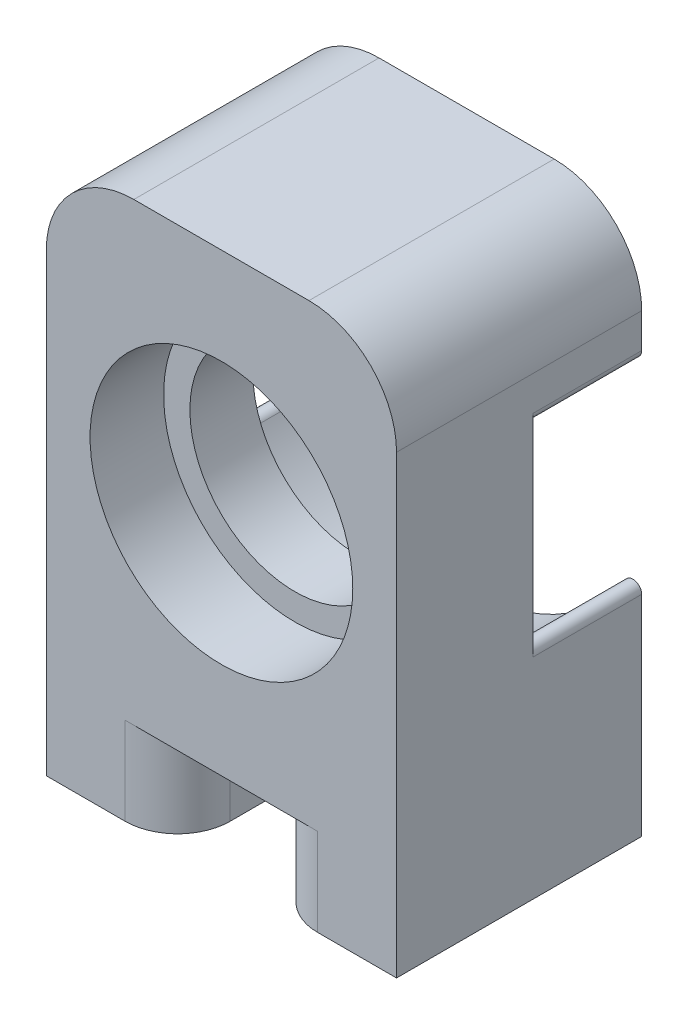
ISO-10303-21;
HEADER;
FILE_DESCRIPTION(('STEP AP214'),'2;1');
FILE_NAME('part.step','',(''),(''),'','','');
FILE_SCHEMA(('AUTOMOTIVE_DESIGN { 1 0 10303 214 1 1 1 1 }'));
ENDSEC;
DATA;
#1=APPLICATION_CONTEXT('core data for automotive mechanical design processes');
#2=APPLICATION_PROTOCOL_DEFINITION('international standard','automotive_design',2000,#1);
#3=PRODUCT_CONTEXT('',#1,'mechanical');
#4=PRODUCT('Part','Part','',(#3));
#5=PRODUCT_RELATED_PRODUCT_CATEGORY('part','',(#4));
#6=PRODUCT_DEFINITION_FORMATION('','',#4);
#7=PRODUCT_DEFINITION_CONTEXT('part definition',#1,'design');
#8=PRODUCT_DEFINITION('design','',#6,#7);
#9=PRODUCT_DEFINITION_SHAPE('','',#8);
#10=(LENGTH_UNIT() NAMED_UNIT(*) SI_UNIT(.MILLI.,.METRE.));
#11=(NAMED_UNIT(*) PLANE_ANGLE_UNIT() SI_UNIT($,.RADIAN.));
#12=(NAMED_UNIT(*) SI_UNIT($,.STERADIAN.) SOLID_ANGLE_UNIT());
#13=UNCERTAINTY_MEASURE_WITH_UNIT(LENGTH_MEASURE(1.E-05),#10,'distance_accuracy_value','');
#14=(GEOMETRIC_REPRESENTATION_CONTEXT(3) GLOBAL_UNCERTAINTY_ASSIGNED_CONTEXT((#13)) GLOBAL_UNIT_ASSIGNED_CONTEXT((#10,
#11,#12)) REPRESENTATION_CONTEXT('',''));
#15=CARTESIAN_POINT('',(0.,0.,0.));
#16=DIRECTION('',(0.,0.,1.));
#17=DIRECTION('',(1.,0.,0.));
#18=AXIS2_PLACEMENT_3D('',#15,#16,#17);
#19=CARTESIAN_POINT('',(-9.5,8.52598539659697,6.2));
#20=DIRECTION('',(0.,0.,-1.));
#21=DIRECTION('',(-1.,0.,0.));
#22=AXIS2_PLACEMENT_3D('',#19,#20,#21);
#23=CYLINDRICAL_SURFACE('',#22,0.5);
#24=CARTESIAN_POINT('',(-9.5,8.52598539659697,0.));
#25=DIRECTION('',(0.,0.,-1.));
#26=DIRECTION('',(-1.,0.,0.));
#27=AXIS2_PLACEMENT_3D('',#24,#25,#26);
#28=CIRCLE('',#27,0.5);
#29=CARTESIAN_POINT('',(-9.07777777777778,8.25816382341488,0.));
#30=VERTEX_POINT('',#29);
#31=CARTESIAN_POINT('',(-10.,8.52598539659697,0.));
#32=VERTEX_POINT('',#31);
#33=EDGE_CURVE('E270',#30,#32,#28,.T.);
#34=ORIENTED_EDGE('',*,*,#33,.F.);
#35=DIRECTION('',(0.,0.,-1.));
#36=VECTOR('',#35,1.);
#37=CARTESIAN_POINT('',(-9.07777777777778,8.25816382341488,6.2));
#38=LINE('',#37,#36);
#39=CARTESIAN_POINT('',(-9.07777777777778,8.25816382341488,6.2));
#40=VERTEX_POINT('',#39);
#41=EDGE_CURVE('E256',#40,#30,#38,.T.);
#42=ORIENTED_EDGE('',*,*,#41,.F.);
#43=CARTESIAN_POINT('',(-9.5,8.52598539659697,6.2));
#44=DIRECTION('',(0.,0.,1.));
#45=DIRECTION('',(-1.,0.,0.));
#46=AXIS2_PLACEMENT_3D('',#43,#44,#45);
#47=CIRCLE('',#46,0.5);
#48=CARTESIAN_POINT('',(-10.,8.52598539659697,6.2));
#49=VERTEX_POINT('',#48);
#50=EDGE_CURVE('E429',#49,#40,#47,.T.);
#51=ORIENTED_EDGE('',*,*,#50,.F.);
#52=DIRECTION('',(0.,0.,1.));
#53=VECTOR('',#52,1.);
#54=CARTESIAN_POINT('',(-10.,8.52598539659697,14.));
#55=LINE('',#54,#53);
#56=EDGE_CURVE('E345',#32,#49,#55,.T.);
#57=ORIENTED_EDGE('',*,*,#56,.F.);
#58=EDGE_LOOP('',(#34,#42,#51,#57));
#59=FACE_BOUND('',#58,.T.);
#60=ADVANCED_FACE('F17',(#59),#23,.T.);
#61=CARTESIAN_POINT('',(-9.5,-3.52598539659698,6.2));
#62=DIRECTION('',(0.,0.,-1.));
#63=DIRECTION('',(-1.,0.,0.));
#64=AXIS2_PLACEMENT_3D('',#61,#62,#63);
#65=CYLINDRICAL_SURFACE('',#64,0.5);
#66=CARTESIAN_POINT('',(-9.5,-3.52598539659698,6.2));
#67=DIRECTION('',(0.,0.,1.));
#68=DIRECTION('',(-1.,0.,0.));
#69=AXIS2_PLACEMENT_3D('',#66,#67,#68);
#70=CIRCLE('',#69,0.5);
#71=CARTESIAN_POINT('',(-9.07777777777778,-3.25816382341489,6.2));
#72=VERTEX_POINT('',#71);
#73=CARTESIAN_POINT('',(-10.,-3.52598539659698,6.2));
#74=VERTEX_POINT('',#73);
#75=EDGE_CURVE('E428',#72,#74,#70,.T.);
#76=ORIENTED_EDGE('',*,*,#75,.F.);
#77=DIRECTION('',(0.,0.,1.));
#78=VECTOR('',#77,1.);
#79=CARTESIAN_POINT('',(-9.07777777777778,-3.25816382341488,6.2));
#80=LINE('',#79,#78);
#81=CARTESIAN_POINT('',(-9.07777777777778,-3.25816382341489,0.));
#82=VERTEX_POINT('',#81);
#83=EDGE_CURVE('E336',#82,#72,#80,.T.);
#84=ORIENTED_EDGE('',*,*,#83,.F.);
#85=CARTESIAN_POINT('',(-9.5,-3.52598539659698,0.));
#86=DIRECTION('',(0.,0.,-1.));
#87=DIRECTION('',(-1.,0.,0.));
#88=AXIS2_PLACEMENT_3D('',#85,#86,#87);
#89=CIRCLE('',#88,0.5);
#90=CARTESIAN_POINT('',(-10.,-3.52598539659698,0.));
#91=VERTEX_POINT('',#90);
#92=EDGE_CURVE('E420',#91,#82,#89,.T.);
#93=ORIENTED_EDGE('',*,*,#92,.F.);
#94=DIRECTION('',(0.,0.,-1.));
#95=VECTOR('',#94,1.);
#96=CARTESIAN_POINT('',(-10.,-3.52598539659698,14.));
#97=LINE('',#96,#95);
#98=EDGE_CURVE('E349',#74,#91,#97,.T.);
#99=ORIENTED_EDGE('',*,*,#98,.F.);
#100=EDGE_LOOP('',(#76,#84,#93,#99));
#101=FACE_BOUND('',#100,.T.);
#102=ADVANCED_FACE('F559',(#101),#65,.T.);
#103=CARTESIAN_POINT('',(9.5,-3.52598539659698,6.2));
#104=DIRECTION('',(0.,0.,-1.));
#105=DIRECTION('',(-1.,0.,0.));
#106=AXIS2_PLACEMENT_3D('',#103,#104,#105);
#107=CYLINDRICAL_SURFACE('',#106,0.5);
#108=CARTESIAN_POINT('',(9.5,-3.52598539659698,0.));
#109=DIRECTION('',(0.,0.,-1.));
#110=DIRECTION('',(-1.,0.,0.));
#111=AXIS2_PLACEMENT_3D('',#108,#109,#110);
#112=CIRCLE('',#111,0.5);
#113=CARTESIAN_POINT('',(9.07777777777778,-3.2581638234149,0.));
#114=VERTEX_POINT('',#113);
#115=CARTESIAN_POINT('',(10.,-3.52598539659698,0.));
#116=VERTEX_POINT('',#115);
#117=EDGE_CURVE('E294',#114,#116,#112,.T.);
#118=ORIENTED_EDGE('',*,*,#117,.F.);
#119=DIRECTION('',(0.,0.,-1.));
#120=VECTOR('',#119,1.);
#121=CARTESIAN_POINT('',(9.07777777777778,-3.25816382341489,6.2));
#122=LINE('',#121,#120);
#123=CARTESIAN_POINT('',(9.07777777777778,-3.2581638234149,6.2));
#124=VERTEX_POINT('',#123);
#125=EDGE_CURVE('E334',#124,#114,#122,.T.);
#126=ORIENTED_EDGE('',*,*,#125,.F.);
#127=CARTESIAN_POINT('',(9.5,-3.52598539659698,6.2));
#128=DIRECTION('',(0.,0.,1.));
#129=DIRECTION('',(-1.,0.,0.));
#130=AXIS2_PLACEMENT_3D('',#127,#128,#129);
#131=CIRCLE('',#130,0.5);
#132=CARTESIAN_POINT('',(10.,-3.52598539659698,6.2));
#133=VERTEX_POINT('',#132);
#134=EDGE_CURVE('E419',#133,#124,#131,.T.);
#135=ORIENTED_EDGE('',*,*,#134,.F.);
#136=DIRECTION('',(0.,0.,1.));
#137=VECTOR('',#136,1.);
#138=CARTESIAN_POINT('',(10.,-3.52598539659698,14.));
#139=LINE('',#138,#137);
#140=EDGE_CURVE('E321',#116,#133,#139,.T.);
#141=ORIENTED_EDGE('',*,*,#140,.F.);
#142=EDGE_LOOP('',(#118,#126,#135,#141));
#143=FACE_BOUND('',#142,.T.);
#144=ADVANCED_FACE('F609',(#143),#107,.T.);
#145=CARTESIAN_POINT('',(9.5,8.52598539659697,6.2));
#146=DIRECTION('',(0.,0.,-1.));
#147=DIRECTION('',(-1.,0.,0.));
#148=AXIS2_PLACEMENT_3D('',#145,#146,#147);
#149=CYLINDRICAL_SURFACE('',#148,0.5);
#150=CARTESIAN_POINT('',(9.5,8.52598539659697,6.2));
#151=DIRECTION('',(0.,0.,1.));
#152=DIRECTION('',(-1.,0.,0.));
#153=AXIS2_PLACEMENT_3D('',#150,#151,#152);
#154=CIRCLE('',#153,0.5);
#155=CARTESIAN_POINT('',(9.07777777777778,8.25816382341488,6.2));
#156=VERTEX_POINT('',#155);
#157=CARTESIAN_POINT('',(10.,8.52598539659697,6.2));
#158=VERTEX_POINT('',#157);
#159=EDGE_CURVE('E251',#156,#158,#154,.T.);
#160=ORIENTED_EDGE('',*,*,#159,.F.);
#161=DIRECTION('',(0.,0.,1.));
#162=VECTOR('',#161,1.);
#163=CARTESIAN_POINT('',(9.07777777777778,8.25816382341488,6.2));
#164=LINE('',#163,#162);
#165=CARTESIAN_POINT('',(9.07777777777778,8.25816382341488,0.));
#166=VERTEX_POINT('',#165);
#167=EDGE_CURVE('E247',#166,#156,#164,.T.);
#168=ORIENTED_EDGE('',*,*,#167,.F.);
#169=CARTESIAN_POINT('',(9.5,8.52598539659697,0.));
#170=DIRECTION('',(0.,0.,-1.));
#171=DIRECTION('',(-1.,0.,0.));
#172=AXIS2_PLACEMENT_3D('',#169,#170,#171);
#173=CIRCLE('',#172,0.5);
#174=CARTESIAN_POINT('',(10.,8.52598539659697,0.));
#175=VERTEX_POINT('',#174);
#176=EDGE_CURVE('E253',#175,#166,#173,.T.);
#177=ORIENTED_EDGE('',*,*,#176,.F.);
#178=DIRECTION('',(0.,0.,-1.));
#179=VECTOR('',#178,1.);
#180=CARTESIAN_POINT('',(10.,8.52598539659697,14.));
#181=LINE('',#180,#179);
#182=EDGE_CURVE('E302',#158,#175,#181,.T.);
#183=ORIENTED_EDGE('',*,*,#182,.F.);
#184=EDGE_LOOP('',(#160,#168,#177,#183));
#185=FACE_BOUND('',#184,.T.);
#186=ADVANCED_FACE('F249',(#185),#149,.T.);
#187=CARTESIAN_POINT('',(-5.5,-15.5,4.));
#188=DIRECTION('',(0.,-1.,0.));
#189=DIRECTION('',(0.,0.,-1.));
#190=AXIS2_PLACEMENT_3D('',#187,#188,#189);
#191=CYLINDRICAL_SURFACE('',#190,1.25);
#192=CARTESIAN_POINT('',(-5.5,-8.,4.));
#193=DIRECTION('',(0.,-1.,0.));
#194=DIRECTION('',(0.,0.,-1.));
#195=AXIS2_PLACEMENT_3D('',#192,#193,#194);
#196=CIRCLE('',#195,1.25);
#197=CARTESIAN_POINT('',(-5.5,-8.,2.75));
#198=VERTEX_POINT('',#197);
#199=EDGE_CURVE('E11',#198,#198,#196,.T.);
#200=ORIENTED_EDGE('',*,*,#199,.F.);
#201=EDGE_LOOP('',(#200));
#202=FACE_BOUND('',#201,.T.);
#203=CARTESIAN_POINT('',(-5.5,-15.5,4.));
#204=DIRECTION('',(0.,-1.,0.));
#205=DIRECTION('',(0.,0.,-1.));
#206=AXIS2_PLACEMENT_3D('',#203,#204,#205);
#207=CIRCLE('',#206,1.25);
#208=CARTESIAN_POINT('',(-5.5,-15.5,2.75));
#209=VERTEX_POINT('',#208);
#210=EDGE_CURVE('E400',#209,#209,#207,.T.);
#211=ORIENTED_EDGE('',*,*,#210,.T.);
#212=EDGE_LOOP('',(#211));
#213=FACE_BOUND('',#212,.T.);
#214=ADVANCED_FACE('F620',(#202,#213),#191,.F.);
#215=CARTESIAN_POINT('',(-5.5,-8.,4.));
#216=DIRECTION('',(0.,-1.,0.));
#217=DIRECTION('',(0.,0.,-1.));
#218=AXIS2_PLACEMENT_3D('',#215,#216,#217);
#219=CONICAL_SURFACE('',#218,1.25,1.02974425867665);
#220=CARTESIAN_POINT('',(-5.5,-7.24892422621555,4.));
#221=VERTEX_POINT('',#220);
#222=VERTEX_LOOP('',#221);
#223=FACE_BOUND('',#222,.T.);
#224=ORIENTED_EDGE('',*,*,#199,.T.);
#225=EDGE_LOOP('',(#224));
#226=FACE_BOUND('',#225,.T.);
#227=ADVANCED_FACE('F618',(#223,#226),#219,.F.);
#228=CARTESIAN_POINT('',(5.5,-15.5,4.));
#229=DIRECTION('',(0.,-1.,0.));
#230=DIRECTION('',(0.,0.,-1.));
#231=AXIS2_PLACEMENT_3D('',#228,#229,#230);
#232=CYLINDRICAL_SURFACE('',#231,1.25);
#233=CARTESIAN_POINT('',(5.5,-8.,4.));
#234=DIRECTION('',(0.,-1.,0.));
#235=DIRECTION('',(0.,0.,-1.));
#236=AXIS2_PLACEMENT_3D('',#233,#234,#235);
#237=CIRCLE('',#236,1.25);
#238=CARTESIAN_POINT('',(5.5,-8.,2.75));
#239=VERTEX_POINT('',#238);
#240=EDGE_CURVE('E20',#239,#239,#237,.T.);
#241=ORIENTED_EDGE('',*,*,#240,.F.);
#242=EDGE_LOOP('',(#241));
#243=FACE_BOUND('',#242,.T.);
#244=CARTESIAN_POINT('',(5.5,-15.5,4.));
#245=DIRECTION('',(0.,-1.,0.));
#246=DIRECTION('',(0.,0.,-1.));
#247=AXIS2_PLACEMENT_3D('',#244,#245,#246);
#248=CIRCLE('',#247,1.25);
#249=CARTESIAN_POINT('',(5.5,-15.5,2.75));
#250=VERTEX_POINT('',#249);
#251=EDGE_CURVE('E501',#250,#250,#248,.T.);
#252=ORIENTED_EDGE('',*,*,#251,.T.);
#253=EDGE_LOOP('',(#252));
#254=FACE_BOUND('',#253,.T.);
#255=ADVANCED_FACE('F622',(#243,#254),#232,.F.);
#256=CARTESIAN_POINT('',(5.5,-8.,4.));
#257=DIRECTION('',(0.,-1.,0.));
#258=DIRECTION('',(0.,0.,-1.));
#259=AXIS2_PLACEMENT_3D('',#256,#257,#258);
#260=CONICAL_SURFACE('',#259,1.25,1.02974425867665);
#261=CARTESIAN_POINT('',(5.5,-7.24892422621555,4.));
#262=VERTEX_POINT('',#261);
#263=VERTEX_LOOP('',#262);
#264=FACE_BOUND('',#263,.T.);
#265=ORIENTED_EDGE('',*,*,#240,.T.);
#266=EDGE_LOOP('',(#265));
#267=FACE_BOUND('',#266,.T.);
#268=ADVANCED_FACE('F630',(#264,#267),#260,.F.);
#269=CARTESIAN_POINT('',(5.5,0.,11.));
#270=DIRECTION('',(0.,-1.,0.));
#271=DIRECTION('',(0.,0.,-1.));
#272=AXIS2_PLACEMENT_3D('',#269,#270,#271);
#273=CYLINDRICAL_SURFACE('',#272,3.);
#274=CARTESIAN_POINT('',(5.5,-10.5,11.));
#275=DIRECTION('',(0.,1.,0.));
#276=DIRECTION('',(0.,0.,1.));
#277=AXIS2_PLACEMENT_3D('',#274,#275,#276);
#278=CIRCLE('',#277,3.);
#279=CARTESIAN_POINT('',(2.5,-10.5,11.));
#280=VERTEX_POINT('',#279);
#281=CARTESIAN_POINT('',(5.5,-10.5,14.));
#282=VERTEX_POINT('',#281);
#283=EDGE_CURVE('E463',#280,#282,#278,.T.);
#284=ORIENTED_EDGE('',*,*,#283,.F.);
#285=DIRECTION('',(0.,1.,0.));
#286=VECTOR('',#285,1.);
#287=CARTESIAN_POINT('',(2.5,-10.5,11.));
#288=LINE('',#287,#286);
#289=CARTESIAN_POINT('',(2.5,-15.5,11.));
#290=VERTEX_POINT('',#289);
#291=EDGE_CURVE('E450',#290,#280,#288,.T.);
#292=ORIENTED_EDGE('',*,*,#291,.F.);
#293=CARTESIAN_POINT('',(5.5,-15.5,11.));
#294=DIRECTION('',(0.,-1.,0.));
#295=DIRECTION('',(0.,0.,1.));
#296=AXIS2_PLACEMENT_3D('',#293,#294,#295);
#297=CIRCLE('',#296,3.);
#298=CARTESIAN_POINT('',(5.5,-15.5,14.));
#299=VERTEX_POINT('',#298);
#300=EDGE_CURVE('E492',#299,#290,#297,.T.);
#301=ORIENTED_EDGE('',*,*,#300,.F.);
#302=DIRECTION('',(0.,-1.,0.));
#303=VECTOR('',#302,1.);
#304=CARTESIAN_POINT('',(5.5,0.,14.));
#305=LINE('',#304,#303);
#306=EDGE_CURVE('E407',#282,#299,#305,.T.);
#307=ORIENTED_EDGE('',*,*,#306,.F.);
#308=EDGE_LOOP('',(#284,#292,#301,#307));
#309=FACE_BOUND('',#308,.T.);
#310=ADVANCED_FACE('F495',(#309),#273,.T.);
#311=CARTESIAN_POINT('',(-5.5,0.,11.));
#312=DIRECTION('',(0.,1.,0.));
#313=DIRECTION('',(0.,0.,1.));
#314=AXIS2_PLACEMENT_3D('',#311,#312,#313);
#315=CYLINDRICAL_SURFACE('',#314,3.);
#316=CARTESIAN_POINT('',(-5.5,-15.5,11.));
#317=DIRECTION('',(0.,-1.,0.));
#318=DIRECTION('',(0.,0.,1.));
#319=AXIS2_PLACEMENT_3D('',#316,#317,#318);
#320=CIRCLE('',#319,3.);
#321=CARTESIAN_POINT('',(-2.5,-15.5,11.));
#322=VERTEX_POINT('',#321);
#323=CARTESIAN_POINT('',(-5.5,-15.5,14.));
#324=VERTEX_POINT('',#323);
#325=EDGE_CURVE('E384',#322,#324,#320,.T.);
#326=ORIENTED_EDGE('',*,*,#325,.F.);
#327=DIRECTION('',(0.,-1.,0.));
#328=VECTOR('',#327,1.);
#329=CARTESIAN_POINT('',(-2.5,-10.5,11.));
#330=LINE('',#329,#328);
#331=CARTESIAN_POINT('',(-2.5,-10.5,11.));
#332=VERTEX_POINT('',#331);
#333=EDGE_CURVE('E465',#332,#322,#330,.T.);
#334=ORIENTED_EDGE('',*,*,#333,.F.);
#335=CARTESIAN_POINT('',(-5.5,-10.5,11.));
#336=DIRECTION('',(0.,1.,0.));
#337=DIRECTION('',(0.,0.,1.));
#338=AXIS2_PLACEMENT_3D('',#335,#336,#337);
#339=CIRCLE('',#338,3.);
#340=CARTESIAN_POINT('',(-5.5,-10.5,14.));
#341=VERTEX_POINT('',#340);
#342=EDGE_CURVE('E311',#341,#332,#339,.T.);
#343=ORIENTED_EDGE('',*,*,#342,.F.);
#344=DIRECTION('',(0.,1.,0.));
#345=VECTOR('',#344,1.);
#346=CARTESIAN_POINT('',(-5.5,0.,14.));
#347=LINE('',#346,#345);
#348=EDGE_CURVE('E398',#324,#341,#347,.T.);
#349=ORIENTED_EDGE('',*,*,#348,.F.);
#350=EDGE_LOOP('',(#326,#334,#343,#349));
#351=FACE_BOUND('',#350,.T.);
#352=ADVANCED_FACE('F634',(#351),#315,.T.);
#353=CARTESIAN_POINT('',(5.5,-10.5,3.));
#354=DIRECTION('',(0.,1.,0.));
#355=DIRECTION('',(0.,0.,1.));
#356=AXIS2_PLACEMENT_3D('',#353,#354,#355);
#357=CYLINDRICAL_SURFACE('',#356,3.);
#358=CARTESIAN_POINT('',(5.5,-10.5,3.));
#359=DIRECTION('',(0.,1.,0.));
#360=DIRECTION('',(0.,0.,1.));
#361=AXIS2_PLACEMENT_3D('',#358,#359,#360);
#362=CIRCLE('',#361,3.);
#363=CARTESIAN_POINT('',(5.5,-10.5,0.));
#364=VERTEX_POINT('',#363);
#365=CARTESIAN_POINT('',(2.5,-10.5,3.));
#366=VERTEX_POINT('',#365);
#367=EDGE_CURVE('E282',#364,#366,#362,.T.);
#368=ORIENTED_EDGE('',*,*,#367,.F.);
#369=DIRECTION('',(0.,1.,0.));
#370=VECTOR('',#369,1.);
#371=CARTESIAN_POINT('',(5.5,-10.5,0.));
#372=LINE('',#371,#370);
#373=CARTESIAN_POINT('',(5.5,-15.5,0.));
#374=VERTEX_POINT('',#373);
#375=EDGE_CURVE('E356',#374,#364,#372,.T.);
#376=ORIENTED_EDGE('',*,*,#375,.F.);
#377=CARTESIAN_POINT('',(5.5,-15.5,3.));
#378=DIRECTION('',(0.,-1.,0.));
#379=DIRECTION('',(0.,0.,1.));
#380=AXIS2_PLACEMENT_3D('',#377,#378,#379);
#381=CIRCLE('',#380,3.);
#382=CARTESIAN_POINT('',(2.5,-15.5,3.));
#383=VERTEX_POINT('',#382);
#384=EDGE_CURVE('E483',#383,#374,#381,.T.);
#385=ORIENTED_EDGE('',*,*,#384,.F.);
#386=DIRECTION('',(0.,-1.,0.));
#387=VECTOR('',#386,1.);
#388=CARTESIAN_POINT('',(2.5,-15.5,3.));
#389=LINE('',#388,#387);
#390=EDGE_CURVE('E447',#366,#383,#389,.T.);
#391=ORIENTED_EDGE('',*,*,#390,.F.);
#392=EDGE_LOOP('',(#368,#376,#385,#391));
#393=FACE_BOUND('',#392,.T.);
#394=ADVANCED_FACE('F481',(#393),#357,.T.);
#395=CARTESIAN_POINT('',(-5.5,-10.5,3.));
#396=DIRECTION('',(0.,-1.,0.));
#397=DIRECTION('',(0.,0.,-1.));
#398=AXIS2_PLACEMENT_3D('',#395,#396,#397);
#399=CYLINDRICAL_SURFACE('',#398,3.);
#400=CARTESIAN_POINT('',(-5.5,-15.5,3.));
#401=DIRECTION('',(0.,-1.,0.));
#402=DIRECTION('',(0.,0.,1.));
#403=AXIS2_PLACEMENT_3D('',#400,#401,#402);
#404=CIRCLE('',#403,3.);
#405=CARTESIAN_POINT('',(-5.5,-15.5,0.));
#406=VERTEX_POINT('',#405);
#407=CARTESIAN_POINT('',(-2.5,-15.5,3.));
#408=VERTEX_POINT('',#407);
#409=EDGE_CURVE('E342',#406,#408,#404,.T.);
#410=ORIENTED_EDGE('',*,*,#409,.F.);
#411=DIRECTION('',(0.,-1.,0.));
#412=VECTOR('',#411,1.);
#413=CARTESIAN_POINT('',(-5.5,-15.5,0.));
#414=LINE('',#413,#412);
#415=CARTESIAN_POINT('',(-5.5,-10.5,0.));
#416=VERTEX_POINT('',#415);
#417=EDGE_CURVE('E418',#416,#406,#414,.T.);
#418=ORIENTED_EDGE('',*,*,#417,.F.);
#419=CARTESIAN_POINT('',(-5.5,-10.5,3.));
#420=DIRECTION('',(0.,1.,0.));
#421=DIRECTION('',(0.,0.,1.));
#422=AXIS2_PLACEMENT_3D('',#419,#420,#421);
#423=CIRCLE('',#422,3.);
#424=CARTESIAN_POINT('',(-2.5,-10.5,3.));
#425=VERTEX_POINT('',#424);
#426=EDGE_CURVE('E309',#425,#416,#423,.T.);
#427=ORIENTED_EDGE('',*,*,#426,.F.);
#428=DIRECTION('',(0.,1.,0.));
#429=VECTOR('',#428,1.);
#430=CARTESIAN_POINT('',(-2.5,-10.5,3.));
#431=LINE('',#430,#429);
#432=EDGE_CURVE('E451',#408,#425,#431,.T.);
#433=ORIENTED_EDGE('',*,*,#432,.F.);
#434=EDGE_LOOP('',(#410,#418,#427,#433));
#435=FACE_BOUND('',#434,.T.);
#436=ADVANCED_FACE('F640',(#435),#399,.T.);
#437=CARTESIAN_POINT('',(0.,-10.5,0.));
#438=DIRECTION('',(0.,1.,0.));
#439=DIRECTION('',(1.,0.,0.));
#440=AXIS2_PLACEMENT_3D('',#437,#438,#439);
#441=PLANE('',#440);
#442=DIRECTION('',(1.,0.,0.));
#443=VECTOR('',#442,1.);
#444=CARTESIAN_POINT('',(0.,-10.5,14.));
#445=LINE('',#444,#443);
#446=EDGE_CURVE('E402',#341,#282,#445,.T.);
#447=ORIENTED_EDGE('',*,*,#446,.F.);
#448=ORIENTED_EDGE('',*,*,#342,.T.);
#449=DIRECTION('',(0.,0.,-1.));
#450=VECTOR('',#449,1.);
#451=CARTESIAN_POINT('',(-2.5,-10.5,-2.61373756311646));
#452=LINE('',#451,#450);
#453=EDGE_CURVE('E458',#332,#425,#452,.T.);
#454=ORIENTED_EDGE('',*,*,#453,.T.);
#455=ORIENTED_EDGE('',*,*,#426,.T.);
#456=DIRECTION('',(1.,0.,0.));
#457=VECTOR('',#456,1.);
#458=CARTESIAN_POINT('',(0.,-10.5,0.));
#459=LINE('',#458,#457);
#460=EDGE_CURVE('E361',#416,#364,#459,.T.);
#461=ORIENTED_EDGE('',*,*,#460,.T.);
#462=ORIENTED_EDGE('',*,*,#367,.T.);
#463=DIRECTION('',(0.,0.,1.));
#464=VECTOR('',#463,1.);
#465=CARTESIAN_POINT('',(2.5,-10.5,-2.61373756311646));
#466=LINE('',#465,#464);
#467=EDGE_CURVE('E386',#366,#280,#466,.T.);
#468=ORIENTED_EDGE('',*,*,#467,.T.);
#469=ORIENTED_EDGE('',*,*,#283,.T.);
#470=EDGE_LOOP('',(#447,#448,#454,#455,#461,#462,#468,#469));
#471=FACE_BOUND('',#470,.T.);
#472=ADVANCED_FACE('F478',(#471),#441,.F.);
#473=CARTESIAN_POINT('',(-2.5,-10.5,-2.61373756311646));
#474=DIRECTION('',(-1.,0.,0.));
#475=DIRECTION('',(0.,0.,1.));
#476=AXIS2_PLACEMENT_3D('',#473,#474,#475);
#477=PLANE('',#476);
#478=DIRECTION('',(0.,0.,-1.));
#479=VECTOR('',#478,1.);
#480=CARTESIAN_POINT('',(-2.5,-15.5,-2.61373756311646));
#481=LINE('',#480,#479);
#482=EDGE_CURVE('E381',#322,#408,#481,.T.);
#483=ORIENTED_EDGE('',*,*,#482,.T.);
#484=ORIENTED_EDGE('',*,*,#432,.T.);
#485=ORIENTED_EDGE('',*,*,#453,.F.);
#486=ORIENTED_EDGE('',*,*,#333,.T.);
#487=EDGE_LOOP('',(#483,#484,#485,#486));
#488=FACE_BOUND('',#487,.T.);
#489=ADVANCED_FACE('F642',(#488),#477,.F.);
#490=CARTESIAN_POINT('',(2.5,-10.5,-2.61373756311646));
#491=DIRECTION('',(1.,0.,0.));
#492=DIRECTION('',(0.,1.,0.));
#493=AXIS2_PLACEMENT_3D('',#490,#491,#492);
#494=PLANE('',#493);
#495=ORIENTED_EDGE('',*,*,#467,.F.);
#496=ORIENTED_EDGE('',*,*,#390,.T.);
#497=DIRECTION('',(0.,0.,1.));
#498=VECTOR('',#497,1.);
#499=CARTESIAN_POINT('',(2.5,-15.5,-2.61373756311646));
#500=LINE('',#499,#498);
#501=EDGE_CURVE('E488',#383,#290,#500,.T.);
#502=ORIENTED_EDGE('',*,*,#501,.T.);
#503=ORIENTED_EDGE('',*,*,#291,.T.);
#504=EDGE_LOOP('',(#495,#496,#502,#503));
#505=FACE_BOUND('',#504,.T.);
#506=ADVANCED_FACE('F490',(#505),#494,.F.);
#507=CARTESIAN_POINT('',(-5.,10.5,14.));
#508=DIRECTION('',(0.,0.,-1.));
#509=DIRECTION('',(-1.,0.,0.));
#510=AXIS2_PLACEMENT_3D('',#507,#508,#509);
#511=CYLINDRICAL_SURFACE('',#510,5.);
#512=CARTESIAN_POINT('',(-5.,10.5,14.));
#513=DIRECTION('',(0.,0.,1.));
#514=DIRECTION('',(-1.,0.,0.));
#515=AXIS2_PLACEMENT_3D('',#512,#513,#514);
#516=CIRCLE('',#515,5.);
#517=CARTESIAN_POINT('',(-5.,15.5,14.));
#518=VERTEX_POINT('',#517);
#519=CARTESIAN_POINT('',(-10.,10.5,14.));
#520=VERTEX_POINT('',#519);
#521=EDGE_CURVE('E380',#518,#520,#516,.T.);
#522=ORIENTED_EDGE('',*,*,#521,.F.);
#523=DIRECTION('',(0.,0.,1.));
#524=VECTOR('',#523,1.);
#525=CARTESIAN_POINT('',(-5.,15.5,14.));
#526=LINE('',#525,#524);
#527=CARTESIAN_POINT('',(-5.,15.5,0.));
#528=VERTEX_POINT('',#527);
#529=EDGE_CURVE('E335',#528,#518,#526,.T.);
#530=ORIENTED_EDGE('',*,*,#529,.F.);
#531=CARTESIAN_POINT('',(-5.,10.5,0.));
#532=DIRECTION('',(0.,0.,-1.));
#533=DIRECTION('',(-1.,0.,0.));
#534=AXIS2_PLACEMENT_3D('',#531,#532,#533);
#535=CIRCLE('',#534,5.);
#536=CARTESIAN_POINT('',(-10.,10.5,0.));
#537=VERTEX_POINT('',#536);
#538=EDGE_CURVE('E285',#537,#528,#535,.T.);
#539=ORIENTED_EDGE('',*,*,#538,.F.);
#540=DIRECTION('',(0.,0.,-1.));
#541=VECTOR('',#540,1.);
#542=CARTESIAN_POINT('',(-10.,10.5,14.));
#543=LINE('',#542,#541);
#544=EDGE_CURVE('E371',#520,#537,#543,.T.);
#545=ORIENTED_EDGE('',*,*,#544,.F.);
#546=EDGE_LOOP('',(#522,#530,#539,#545));
#547=FACE_BOUND('',#546,.T.);
#548=ADVANCED_FACE('F569',(#547),#511,.T.);
#549=CARTESIAN_POINT('',(5.,10.5,14.));
#550=DIRECTION('',(0.,0.,-1.));
#551=DIRECTION('',(-1.,0.,0.));
#552=AXIS2_PLACEMENT_3D('',#549,#550,#551);
#553=CYLINDRICAL_SURFACE('',#552,5.);
#554=CARTESIAN_POINT('',(5.,10.5,14.));
#555=DIRECTION('',(0.,0.,1.));
#556=DIRECTION('',(-1.,0.,0.));
#557=AXIS2_PLACEMENT_3D('',#554,#555,#556);
#558=CIRCLE('',#557,5.);
#559=CARTESIAN_POINT('',(10.,10.5,14.));
#560=VERTEX_POINT('',#559);
#561=CARTESIAN_POINT('',(5.,15.5,14.));
#562=VERTEX_POINT('',#561);
#563=EDGE_CURVE('E379',#560,#562,#558,.T.);
#564=ORIENTED_EDGE('',*,*,#563,.F.);
#565=DIRECTION('',(0.,0.,1.));
#566=VECTOR('',#565,1.);
#567=CARTESIAN_POINT('',(10.,10.5,14.));
#568=LINE('',#567,#566);
#569=CARTESIAN_POINT('',(10.,10.5,0.));
#570=VERTEX_POINT('',#569);
#571=EDGE_CURVE('E303',#570,#560,#568,.T.);
#572=ORIENTED_EDGE('',*,*,#571,.F.);
#573=CARTESIAN_POINT('',(5.,10.5,0.));
#574=DIRECTION('',(0.,0.,-1.));
#575=DIRECTION('',(-1.,0.,0.));
#576=AXIS2_PLACEMENT_3D('',#573,#574,#575);
#577=CIRCLE('',#576,5.);
#578=CARTESIAN_POINT('',(5.,15.5,0.));
#579=VERTEX_POINT('',#578);
#580=EDGE_CURVE('E305',#579,#570,#577,.T.);
#581=ORIENTED_EDGE('',*,*,#580,.F.);
#582=DIRECTION('',(0.,0.,-1.));
#583=VECTOR('',#582,1.);
#584=CARTESIAN_POINT('',(5.,15.5,14.));
#585=LINE('',#584,#583);
#586=EDGE_CURVE('E328',#562,#579,#585,.T.);
#587=ORIENTED_EDGE('',*,*,#586,.F.);
#588=EDGE_LOOP('',(#564,#572,#581,#587));
#589=FACE_BOUND('',#588,.T.);
#590=ADVANCED_FACE('F580',(#589),#553,.T.);
#591=CARTESIAN_POINT('',(0.,2.5,9.8));
#592=DIRECTION('',(0.,0.,1.));
#593=DIRECTION('',(1.,0.,0.));
#594=AXIS2_PLACEMENT_3D('',#591,#592,#593);
#595=CYLINDRICAL_SURFACE('',#594,7.5);
#596=CARTESIAN_POINT('',(0.,2.5,9.8));
#597=DIRECTION('',(0.,0.,1.));
#598=DIRECTION('',(1.,0.,0.));
#599=AXIS2_PLACEMENT_3D('',#596,#597,#598);
#600=CIRCLE('',#599,7.5);
#601=CARTESIAN_POINT('',(7.5,2.5,9.8));
#602=VERTEX_POINT('',#601);
#603=EDGE_CURVE('E387',#602,#602,#600,.T.);
#604=ORIENTED_EDGE('',*,*,#603,.F.);
#605=EDGE_LOOP('',(#604));
#606=FACE_BOUND('',#605,.T.);
#607=CARTESIAN_POINT('',(0.,2.5,14.));
#608=DIRECTION('',(0.,0.,1.));
#609=DIRECTION('',(1.,0.,0.));
#610=AXIS2_PLACEMENT_3D('',#607,#608,#609);
#611=CIRCLE('',#610,7.5);
#612=CARTESIAN_POINT('',(7.5,2.5,14.));
#613=VERTEX_POINT('',#612);
#614=EDGE_CURVE('E296',#613,#613,#611,.T.);
#615=ORIENTED_EDGE('',*,*,#614,.T.);
#616=EDGE_LOOP('',(#615));
#617=FACE_BOUND('',#616,.T.);
#618=ADVANCED_FACE('F651',(#606,#617),#595,.F.);
#619=CARTESIAN_POINT('',(0.,2.5,9.8));
#620=DIRECTION('',(0.,0.,1.));
#621=DIRECTION('',(1.,0.,0.));
#622=AXIS2_PLACEMENT_3D('',#619,#620,#621);
#623=PLANE('',#622);
#624=CARTESIAN_POINT('',(0.,2.5,9.8));
#625=DIRECTION('',(0.,0.,-1.));
#626=DIRECTION('',(1.,0.,0.));
#627=AXIS2_PLACEMENT_3D('',#624,#625,#626);
#628=CIRCLE('',#627,6.);
#629=CARTESIAN_POINT('',(6.,2.5,9.8));
#630=VERTEX_POINT('',#629);
#631=EDGE_CURVE('E509',#630,#630,#628,.T.);
#632=ORIENTED_EDGE('',*,*,#631,.T.);
#633=EDGE_LOOP('',(#632));
#634=FACE_BOUND('',#633,.T.);
#635=ORIENTED_EDGE('',*,*,#603,.T.);
#636=EDGE_LOOP('',(#635));
#637=FACE_BOUND('',#636,.T.);
#638=ADVANCED_FACE('F653',(#634,#637),#623,.T.);
#639=CARTESIAN_POINT('',(0.,2.5,6.2));
#640=DIRECTION('',(0.,0.,-1.));
#641=DIRECTION('',(-1.,0.,0.));
#642=AXIS2_PLACEMENT_3D('',#639,#640,#641);
#643=CYLINDRICAL_SURFACE('',#642,10.75);
#644=CARTESIAN_POINT('',(0.,2.5,6.2));
#645=DIRECTION('',(0.,0.,-1.));
#646=DIRECTION('',(-1.,0.,0.));
#647=AXIS2_PLACEMENT_3D('',#644,#645,#646);
#648=CIRCLE('',#647,10.75);
#649=EDGE_CURVE('E424',#124,#72,#648,.T.);
#650=ORIENTED_EDGE('',*,*,#649,.F.);
#651=ORIENTED_EDGE('',*,*,#125,.T.);
#652=CARTESIAN_POINT('',(0.,2.5,0.));
#653=DIRECTION('',(0.,0.,-1.));
#654=DIRECTION('',(-1.,0.,0.));
#655=AXIS2_PLACEMENT_3D('',#652,#653,#654);
#656=CIRCLE('',#655,10.75);
#657=EDGE_CURVE('E295',#114,#82,#656,.T.);
#658=ORIENTED_EDGE('',*,*,#657,.T.);
#659=ORIENTED_EDGE('',*,*,#83,.T.);
#660=EDGE_LOOP('',(#650,#651,#658,#659));
#661=FACE_BOUND('',#660,.T.);
#662=ADVANCED_FACE('F599',(#661),#643,.F.);
#663=CARTESIAN_POINT('',(0.,2.5,6.2));
#664=DIRECTION('',(0.,0.,-1.));
#665=DIRECTION('',(-1.,0.,0.));
#666=AXIS2_PLACEMENT_3D('',#663,#664,#665);
#667=CYLINDRICAL_SURFACE('',#666,10.75);
#668=CARTESIAN_POINT('',(0.,2.5,0.));
#669=DIRECTION('',(0.,0.,-1.));
#670=DIRECTION('',(-1.,0.,0.));
#671=AXIS2_PLACEMENT_3D('',#668,#669,#670);
#672=CIRCLE('',#671,10.75);
#673=EDGE_CURVE('E261',#30,#166,#672,.T.);
#674=ORIENTED_EDGE('',*,*,#673,.T.);
#675=ORIENTED_EDGE('',*,*,#167,.T.);
#676=CARTESIAN_POINT('',(0.,2.5,6.2));
#677=DIRECTION('',(0.,0.,-1.));
#678=DIRECTION('',(-1.,0.,0.));
#679=AXIS2_PLACEMENT_3D('',#676,#677,#678);
#680=CIRCLE('',#679,10.75);
#681=EDGE_CURVE('E434',#40,#156,#680,.T.);
#682=ORIENTED_EDGE('',*,*,#681,.F.);
#683=ORIENTED_EDGE('',*,*,#41,.T.);
#684=EDGE_LOOP('',(#674,#675,#682,#683));
#685=FACE_BOUND('',#684,.T.);
#686=ADVANCED_FACE('F265',(#685),#667,.F.);
#687=CARTESIAN_POINT('',(0.,2.5,6.2));
#688=DIRECTION('',(0.,0.,-1.));
#689=DIRECTION('',(0.,-1.,0.));
#690=AXIS2_PLACEMENT_3D('',#687,#688,#689);
#691=PLANE('',#690);
#692=CARTESIAN_POINT('',(0.,2.5,6.2));
#693=DIRECTION('',(0.,0.,-1.));
#694=DIRECTION('',(-1.,0.,0.));
#695=AXIS2_PLACEMENT_3D('',#692,#693,#694);
#696=CIRCLE('',#695,6.);
#697=CARTESIAN_POINT('',(-6.,2.5,6.2));
#698=VERTEX_POINT('',#697);
#699=EDGE_CURVE('E276',#698,#698,#696,.T.);
#700=ORIENTED_EDGE('',*,*,#699,.F.);
#701=EDGE_LOOP('',(#700));
#702=FACE_BOUND('',#701,.T.);
#703=DIRECTION('',(0.,-1.,0.));
#704=VECTOR('',#703,1.);
#705=CARTESIAN_POINT('',(10.,-15.5,6.2));
#706=LINE('',#705,#704);
#707=EDGE_CURVE('E300',#158,#133,#706,.T.);
#708=ORIENTED_EDGE('',*,*,#707,.T.);
#709=ORIENTED_EDGE('',*,*,#134,.T.);
#710=ORIENTED_EDGE('',*,*,#649,.T.);
#711=ORIENTED_EDGE('',*,*,#75,.T.);
#712=DIRECTION('',(0.,1.,0.));
#713=VECTOR('',#712,1.);
#714=CARTESIAN_POINT('',(-10.,-15.5,6.2));
#715=LINE('',#714,#713);
#716=EDGE_CURVE('E350',#74,#49,#715,.T.);
#717=ORIENTED_EDGE('',*,*,#716,.T.);
#718=ORIENTED_EDGE('',*,*,#50,.T.);
#719=ORIENTED_EDGE('',*,*,#681,.T.);
#720=ORIENTED_EDGE('',*,*,#159,.T.);
#721=EDGE_LOOP('',(#708,#709,#710,#711,#717,#718,#719,#720));
#722=FACE_BOUND('',#721,.T.);
#723=ADVANCED_FACE('F555',(#702,#722),#691,.T.);
#724=CARTESIAN_POINT('',(0.,0.,0.));
#725=DIRECTION('',(0.,0.,-1.));
#726=DIRECTION('',(0.,-1.,0.));
#727=AXIS2_PLACEMENT_3D('',#724,#725,#726);
#728=PLANE('',#727);
#729=ORIENTED_EDGE('',*,*,#657,.F.);
#730=ORIENTED_EDGE('',*,*,#117,.T.);
#731=DIRECTION('',(0.,1.,0.));
#732=VECTOR('',#731,1.);
#733=CARTESIAN_POINT('',(10.,-15.5,0.));
#734=LINE('',#733,#732);
#735=CARTESIAN_POINT('',(10.,-15.5,0.));
#736=VERTEX_POINT('',#735);
#737=EDGE_CURVE('E320',#736,#116,#734,.T.);
#738=ORIENTED_EDGE('',*,*,#737,.F.);
#739=DIRECTION('',(1.,0.,0.));
#740=VECTOR('',#739,1.);
#741=CARTESIAN_POINT('',(-10.,-15.5,0.));
#742=LINE('',#741,#740);
#743=EDGE_CURVE('E520',#374,#736,#742,.T.);
#744=ORIENTED_EDGE('',*,*,#743,.F.);
#745=ORIENTED_EDGE('',*,*,#375,.T.);
#746=ORIENTED_EDGE('',*,*,#460,.F.);
#747=ORIENTED_EDGE('',*,*,#417,.T.);
#748=DIRECTION('',(1.,0.,0.));
#749=VECTOR('',#748,1.);
#750=CARTESIAN_POINT('',(-10.,-15.5,0.));
#751=LINE('',#750,#749);
#752=CARTESIAN_POINT('',(-10.,-15.5,0.));
#753=VERTEX_POINT('',#752);
#754=EDGE_CURVE('E337',#753,#406,#751,.T.);
#755=ORIENTED_EDGE('',*,*,#754,.F.);
#756=DIRECTION('',(0.,-1.,0.));
#757=VECTOR('',#756,1.);
#758=CARTESIAN_POINT('',(-10.,-15.5,0.));
#759=LINE('',#758,#757);
#760=EDGE_CURVE('E353',#91,#753,#759,.T.);
#761=ORIENTED_EDGE('',*,*,#760,.F.);
#762=ORIENTED_EDGE('',*,*,#92,.T.);
#763=EDGE_LOOP('',(#729,#730,#738,#744,#745,#746,#747,#755,#761,#762));
#764=FACE_BOUND('',#763,.T.);
#765=ADVANCED_FACE('F562',(#764),#728,.T.);
#766=CARTESIAN_POINT('',(0.,0.,14.));
#767=DIRECTION('',(0.,0.,-1.));
#768=DIRECTION('',(0.,-1.,0.));
#769=AXIS2_PLACEMENT_3D('',#766,#767,#768);
#770=PLANE('',#769);
#771=ORIENTED_EDGE('',*,*,#614,.F.);
#772=EDGE_LOOP('',(#771));
#773=FACE_BOUND('',#772,.T.);
#774=DIRECTION('',(1.,0.,0.));
#775=VECTOR('',#774,1.);
#776=CARTESIAN_POINT('',(-10.,-15.5,14.));
#777=LINE('',#776,#775);
#778=CARTESIAN_POINT('',(-10.,-15.5,14.));
#779=VERTEX_POINT('',#778);
#780=EDGE_CURVE('E394',#779,#324,#777,.T.);
#781=ORIENTED_EDGE('',*,*,#780,.T.);
#782=ORIENTED_EDGE('',*,*,#348,.T.);
#783=ORIENTED_EDGE('',*,*,#446,.T.);
#784=ORIENTED_EDGE('',*,*,#306,.T.);
#785=DIRECTION('',(1.,0.,0.));
#786=VECTOR('',#785,1.);
#787=CARTESIAN_POINT('',(-10.,-15.5,14.));
#788=LINE('',#787,#786);
#789=CARTESIAN_POINT('',(10.,-15.5,14.));
#790=VERTEX_POINT('',#789);
#791=EDGE_CURVE('E496',#299,#790,#788,.T.);
#792=ORIENTED_EDGE('',*,*,#791,.T.);
#793=DIRECTION('',(0.,1.,0.));
#794=VECTOR('',#793,1.);
#795=CARTESIAN_POINT('',(10.,-15.5,14.));
#796=LINE('',#795,#794);
#797=EDGE_CURVE('E310',#790,#560,#796,.T.);
#798=ORIENTED_EDGE('',*,*,#797,.T.);
#799=ORIENTED_EDGE('',*,*,#563,.T.);
#800=DIRECTION('',(-1.,0.,0.));
#801=VECTOR('',#800,1.);
#802=CARTESIAN_POINT('',(-10.,15.5,14.));
#803=LINE('',#802,#801);
#804=EDGE_CURVE('E324',#562,#518,#803,.T.);
#805=ORIENTED_EDGE('',*,*,#804,.T.);
#806=ORIENTED_EDGE('',*,*,#521,.T.);
#807=DIRECTION('',(0.,-1.,0.));
#808=VECTOR('',#807,1.);
#809=CARTESIAN_POINT('',(-10.,-15.5,14.));
#810=LINE('',#809,#808);
#811=EDGE_CURVE('E370',#520,#779,#810,.T.);
#812=ORIENTED_EDGE('',*,*,#811,.T.);
#813=EDGE_LOOP('',(#781,#782,#783,#784,#792,#798,#799,#805,#806,#812));
#814=FACE_BOUND('',#813,.T.);
#815=ADVANCED_FACE('F566',(#773,#814),#770,.F.);
#816=CARTESIAN_POINT('',(-10.,-15.5,14.));
#817=DIRECTION('',(0.,1.,0.));
#818=DIRECTION('',(1.,0.,0.));
#819=AXIS2_PLACEMENT_3D('',#816,#817,#818);
#820=PLANE('',#819);
#821=ORIENTED_EDGE('',*,*,#210,.F.);
#822=EDGE_LOOP('',(#821));
#823=FACE_BOUND('',#822,.T.);
#824=ORIENTED_EDGE('',*,*,#754,.T.);
#825=ORIENTED_EDGE('',*,*,#409,.T.);
#826=ORIENTED_EDGE('',*,*,#482,.F.);
#827=ORIENTED_EDGE('',*,*,#325,.T.);
#828=ORIENTED_EDGE('',*,*,#780,.F.);
#829=DIRECTION('',(0.,0.,-1.));
#830=VECTOR('',#829,1.);
#831=CARTESIAN_POINT('',(-10.,-15.5,14.));
#832=LINE('',#831,#830);
#833=EDGE_CURVE('E359',#779,#753,#832,.T.);
#834=ORIENTED_EDGE('',*,*,#833,.T.);
#835=EDGE_LOOP('',(#824,#825,#826,#827,#828,#834));
#836=FACE_BOUND('',#835,.T.);
#837=ADVANCED_FACE('F563',(#823,#836),#820,.F.);
#838=CARTESIAN_POINT('',(-10.,-15.5,14.));
#839=DIRECTION('',(1.,0.,0.));
#840=DIRECTION('',(0.,1.,0.));
#841=AXIS2_PLACEMENT_3D('',#838,#839,#840);
#842=PLANE('',#841);
#843=ORIENTED_EDGE('',*,*,#716,.F.);
#844=ORIENTED_EDGE('',*,*,#98,.T.);
#845=ORIENTED_EDGE('',*,*,#760,.T.);
#846=ORIENTED_EDGE('',*,*,#833,.F.);
#847=ORIENTED_EDGE('',*,*,#811,.F.);
#848=ORIENTED_EDGE('',*,*,#544,.T.);
#849=DIRECTION('',(0.,-1.,0.));
#850=VECTOR('',#849,1.);
#851=CARTESIAN_POINT('',(-10.,-15.5,0.));
#852=LINE('',#851,#850);
#853=EDGE_CURVE('E288',#537,#32,#852,.T.);
#854=ORIENTED_EDGE('',*,*,#853,.T.);
#855=ORIENTED_EDGE('',*,*,#56,.T.);
#856=EDGE_LOOP('',(#843,#844,#845,#846,#847,#848,#854,#855));
#857=FACE_BOUND('',#856,.T.);
#858=ADVANCED_FACE('F546',(#857),#842,.F.);
#859=CARTESIAN_POINT('',(-10.,15.5,14.));
#860=DIRECTION('',(0.,-1.,0.));
#861=DIRECTION('',(0.,0.,-1.));
#862=AXIS2_PLACEMENT_3D('',#859,#860,#861);
#863=PLANE('',#862);
#864=ORIENTED_EDGE('',*,*,#804,.F.);
#865=ORIENTED_EDGE('',*,*,#586,.T.);
#866=DIRECTION('',(-1.,0.,0.));
#867=VECTOR('',#866,1.);
#868=CARTESIAN_POINT('',(-10.,15.5,0.));
#869=LINE('',#868,#867);
#870=EDGE_CURVE('E286',#579,#528,#869,.T.);
#871=ORIENTED_EDGE('',*,*,#870,.T.);
#872=ORIENTED_EDGE('',*,*,#529,.T.);
#873=EDGE_LOOP('',(#864,#865,#871,#872));
#874=FACE_BOUND('',#873,.T.);
#875=ADVANCED_FACE('F573',(#874),#863,.F.);
#876=CARTESIAN_POINT('',(10.,-15.5,14.));
#877=DIRECTION('',(-1.,0.,0.));
#878=DIRECTION('',(0.,0.,1.));
#879=AXIS2_PLACEMENT_3D('',#876,#877,#878);
#880=PLANE('',#879);
#881=ORIENTED_EDGE('',*,*,#707,.F.);
#882=ORIENTED_EDGE('',*,*,#182,.T.);
#883=DIRECTION('',(0.,1.,0.));
#884=VECTOR('',#883,1.);
#885=CARTESIAN_POINT('',(10.,-15.5,0.));
#886=LINE('',#885,#884);
#887=EDGE_CURVE('E275',#175,#570,#886,.T.);
#888=ORIENTED_EDGE('',*,*,#887,.T.);
#889=ORIENTED_EDGE('',*,*,#571,.T.);
#890=ORIENTED_EDGE('',*,*,#797,.F.);
#891=DIRECTION('',(0.,0.,-1.));
#892=VECTOR('',#891,1.);
#893=CARTESIAN_POINT('',(10.,-15.5,14.));
#894=LINE('',#893,#892);
#895=EDGE_CURVE('E515',#790,#736,#894,.T.);
#896=ORIENTED_EDGE('',*,*,#895,.T.);
#897=ORIENTED_EDGE('',*,*,#737,.T.);
#898=ORIENTED_EDGE('',*,*,#140,.T.);
#899=EDGE_LOOP('',(#881,#882,#888,#889,#890,#896,#897,#898));
#900=FACE_BOUND('',#899,.T.);
#901=ADVANCED_FACE('F677',(#900),#880,.F.);
#902=CARTESIAN_POINT('',(0.,0.,0.));
#903=DIRECTION('',(0.,0.,-1.));
#904=DIRECTION('',(0.,-1.,0.));
#905=AXIS2_PLACEMENT_3D('',#902,#903,#904);
#906=PLANE('',#905);
#907=ORIENTED_EDGE('',*,*,#887,.F.);
#908=ORIENTED_EDGE('',*,*,#176,.T.);
#909=ORIENTED_EDGE('',*,*,#673,.F.);
#910=ORIENTED_EDGE('',*,*,#33,.T.);
#911=ORIENTED_EDGE('',*,*,#853,.F.);
#912=ORIENTED_EDGE('',*,*,#538,.T.);
#913=ORIENTED_EDGE('',*,*,#870,.F.);
#914=ORIENTED_EDGE('',*,*,#580,.T.);
#915=EDGE_LOOP('',(#907,#908,#909,#910,#911,#912,#913,#914));
#916=FACE_BOUND('',#915,.T.);
#917=ADVANCED_FACE('F267',(#916),#906,.T.);
#918=CARTESIAN_POINT('',(0.,2.5,14.));
#919=DIRECTION('',(0.,0.,-1.));
#920=DIRECTION('',(-1.,0.,0.));
#921=AXIS2_PLACEMENT_3D('',#918,#919,#920);
#922=CYLINDRICAL_SURFACE('',#921,6.);
#923=ORIENTED_EDGE('',*,*,#699,.T.);
#924=EDGE_LOOP('',(#923));
#925=FACE_BOUND('',#924,.T.);
#926=ORIENTED_EDGE('',*,*,#631,.F.);
#927=EDGE_LOOP('',(#926));
#928=FACE_BOUND('',#927,.T.);
#929=ADVANCED_FACE('F589',(#925,#928),#922,.F.);
#930=CARTESIAN_POINT('',(-10.,-15.5,14.));
#931=DIRECTION('',(0.,1.,0.));
#932=DIRECTION('',(1.,0.,0.));
#933=AXIS2_PLACEMENT_3D('',#930,#931,#932);
#934=PLANE('',#933);
#935=ORIENTED_EDGE('',*,*,#251,.F.);
#936=EDGE_LOOP('',(#935));
#937=FACE_BOUND('',#936,.T.);
#938=ORIENTED_EDGE('',*,*,#501,.F.);
#939=ORIENTED_EDGE('',*,*,#384,.T.);
#940=ORIENTED_EDGE('',*,*,#743,.T.);
#941=ORIENTED_EDGE('',*,*,#895,.F.);
#942=ORIENTED_EDGE('',*,*,#791,.F.);
#943=ORIENTED_EDGE('',*,*,#300,.T.);
#944=EDGE_LOOP('',(#938,#939,#940,#941,#942,#943));
#945=FACE_BOUND('',#944,.T.);
#946=ADVANCED_FACE('F497',(#937,#945),#934,.F.);
#947=CLOSED_SHELL('',(#60,#102,#144,#186,#214,#227,#255,#268,#310,#352,#394,#436,#472,#489,#506,
#548,#590,#618,#638,#662,#686,#723,#765,#815,#837,#858,#875,#901,#917,#929,#946));
#948=MANIFOLD_SOLID_BREP('B1',#947);
#949=ADVANCED_BREP_SHAPE_REPRESENTATION('',(#18,#948),#14);
#950=SHAPE_DEFINITION_REPRESENTATION(#9,#949);
ENDSEC;
END-ISO-10303-21;
